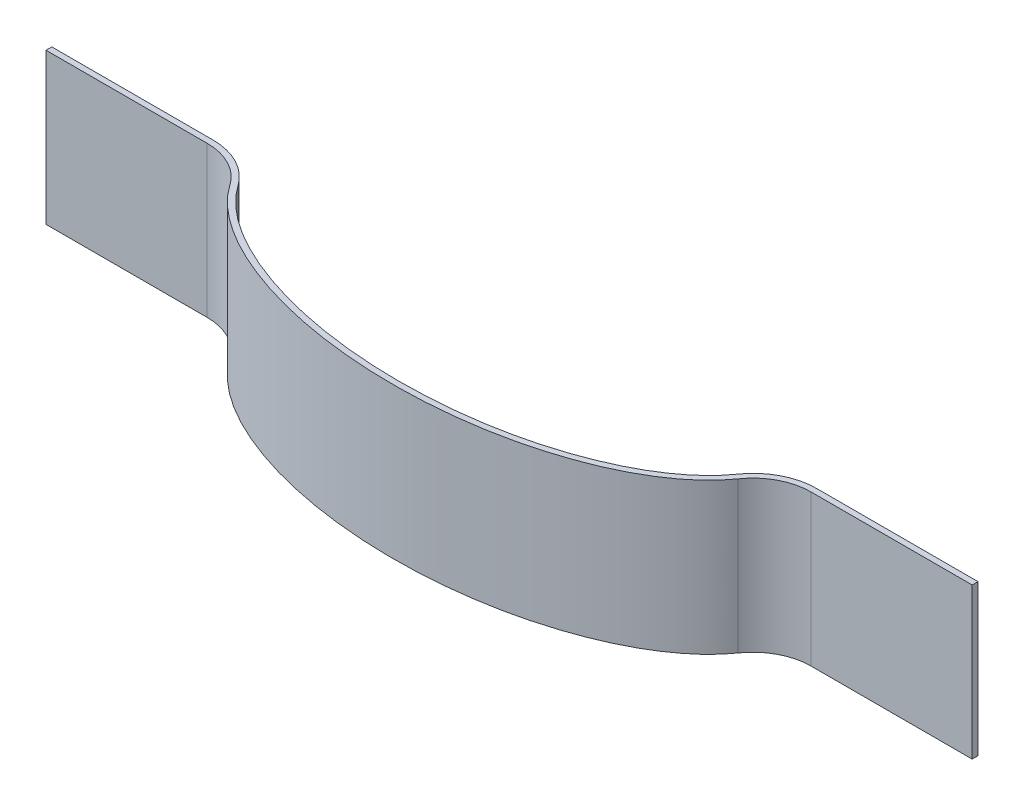
ISO-10303-21;
HEADER;
FILE_DESCRIPTION(('STEP AP214'),'2;1');
FILE_NAME('part.step','',(''),(''),'','','');
FILE_SCHEMA(('AUTOMOTIVE_DESIGN { 1 0 10303 214 1 1 1 1 }'));
ENDSEC;
DATA;
#1=APPLICATION_CONTEXT('core data for automotive mechanical design processes');
#2=APPLICATION_PROTOCOL_DEFINITION('international standard','automotive_design',2000,#1);
#3=PRODUCT_CONTEXT('',#1,'mechanical');
#4=PRODUCT('Part','Part','',(#3));
#5=PRODUCT_RELATED_PRODUCT_CATEGORY('part','',(#4));
#6=PRODUCT_DEFINITION_FORMATION('','',#4);
#7=PRODUCT_DEFINITION_CONTEXT('part definition',#1,'design');
#8=PRODUCT_DEFINITION('design','',#6,#7);
#9=PRODUCT_DEFINITION_SHAPE('','',#8);
#10=(LENGTH_UNIT() NAMED_UNIT(*) SI_UNIT(.MILLI.,.METRE.));
#11=(NAMED_UNIT(*) PLANE_ANGLE_UNIT() SI_UNIT($,.RADIAN.));
#12=(NAMED_UNIT(*) SI_UNIT($,.STERADIAN.) SOLID_ANGLE_UNIT());
#13=UNCERTAINTY_MEASURE_WITH_UNIT(LENGTH_MEASURE(1.E-05),#10,'distance_accuracy_value','');
#14=(GEOMETRIC_REPRESENTATION_CONTEXT(3) GLOBAL_UNCERTAINTY_ASSIGNED_CONTEXT((#13)) GLOBAL_UNIT_ASSIGNED_CONTEXT((#10,
#11,#12)) REPRESENTATION_CONTEXT('',''));
#15=CARTESIAN_POINT('',(0.,0.,0.));
#16=DIRECTION('',(0.,0.,1.));
#17=DIRECTION('',(1.,0.,0.));
#18=AXIS2_PLACEMENT_3D('',#15,#16,#17);
#19=CARTESIAN_POINT('',(82.8323720749977,15.9999999949704,4.99999999502958));
#20=DIRECTION('',(-1.,0.,0.));
#21=DIRECTION('',(0.,0.,1.));
#22=AXIS2_PLACEMENT_3D('',#19,#20,#21);
#23=PLANE('',#22);
#24=DIRECTION('',(0.,-1.,0.));
#25=VECTOR('',#24,1.);
#26=CARTESIAN_POINT('',(82.8323720749977,15.9999999949704,5.99999999502965));
#27=LINE('',#26,#25);
#28=CARTESIAN_POINT('',(82.8323720749977,15.9999999949704,5.99999999502965));
#29=VERTEX_POINT('',#28);
#30=CARTESIAN_POINT('',(82.8323720749977,3.,5.99999999502965));
#31=VERTEX_POINT('',#30);
#32=EDGE_CURVE('E404',#29,#31,#27,.T.);
#33=ORIENTED_EDGE('',*,*,#32,.T.);
#34=DIRECTION('',(0.,0.,-1.));
#35=VECTOR('',#34,1.);
#36=CARTESIAN_POINT('',(82.8323720749977,3.,4.99999999502958));
#37=LINE('',#36,#35);
#38=CARTESIAN_POINT('',(82.8323720749977,3.,5.49999999502962));
#39=VERTEX_POINT('',#38);
#40=EDGE_CURVE('E12',#31,#39,#37,.T.);
#41=ORIENTED_EDGE('',*,*,#40,.T.);
#42=DIRECTION('',(0.,-1.,0.));
#43=VECTOR('',#42,1.);
#44=CARTESIAN_POINT('',(82.8323720749977,15.9999999949704,5.49999999502962));
#45=LINE('',#44,#43);
#46=CARTESIAN_POINT('',(82.8323720749977,15.9999999949704,5.49999999502962));
#47=VERTEX_POINT('',#46);
#48=EDGE_CURVE('E322',#47,#39,#45,.T.);
#49=ORIENTED_EDGE('',*,*,#48,.F.);
#50=DIRECTION('',(0.,0.,-1.));
#51=VECTOR('',#50,1.);
#52=CARTESIAN_POINT('',(82.8323720749977,15.9999999949704,4.99999999502958));
#53=LINE('',#52,#51);
#54=EDGE_CURVE('E139',#29,#47,#53,.T.);
#55=ORIENTED_EDGE('',*,*,#54,.F.);
#56=EDGE_LOOP('',(#33,#41,#49,#55));
#57=FACE_BOUND('',#56,.T.);
#58=ADVANCED_FACE('F128',(#57),#23,.F.);
#59=CARTESIAN_POINT('',(3.,2.99999999999999,4.99999999502958));
#60=DIRECTION('',(1.,0.,0.));
#61=DIRECTION('',(0.,1.,0.));
#62=AXIS2_PLACEMENT_3D('',#59,#60,#61);
#63=PLANE('',#62);
#64=DIRECTION('',(0.,-1.,0.));
#65=VECTOR('',#64,1.);
#66=CARTESIAN_POINT('',(3.,15.9999999949704,5.99999999502963));
#67=LINE('',#66,#65);
#68=CARTESIAN_POINT('',(3.,15.9999999949704,5.99999999502963));
#69=VERTEX_POINT('',#68);
#70=CARTESIAN_POINT('',(3.,2.99999999999999,5.99999999502963));
#71=VERTEX_POINT('',#70);
#72=EDGE_CURVE('E399',#69,#71,#67,.T.);
#73=ORIENTED_EDGE('',*,*,#72,.F.);
#74=DIRECTION('',(0.,0.,-1.));
#75=VECTOR('',#74,1.);
#76=CARTESIAN_POINT('',(3.,15.9999999949704,4.99999999502958));
#77=LINE('',#76,#75);
#78=CARTESIAN_POINT('',(3.,15.9999999949704,5.49999999502963));
#79=VERTEX_POINT('',#78);
#80=EDGE_CURVE('E306',#69,#79,#77,.T.);
#81=ORIENTED_EDGE('',*,*,#80,.T.);
#82=DIRECTION('',(0.,-1.,0.));
#83=VECTOR('',#82,1.);
#84=CARTESIAN_POINT('',(3.,15.9999999949704,5.49999999502963));
#85=LINE('',#84,#83);
#86=CARTESIAN_POINT('',(3.,2.99999999999999,5.49999999502963));
#87=VERTEX_POINT('',#86);
#88=EDGE_CURVE('E327',#79,#87,#85,.T.);
#89=ORIENTED_EDGE('',*,*,#88,.T.);
#90=DIRECTION('',(0.,0.,-1.));
#91=VECTOR('',#90,1.);
#92=CARTESIAN_POINT('',(3.,2.99999999999999,4.99999999502958));
#93=LINE('',#92,#91);
#94=EDGE_CURVE('E304',#71,#87,#93,.T.);
#95=ORIENTED_EDGE('',*,*,#94,.F.);
#96=EDGE_LOOP('',(#73,#81,#89,#95));
#97=FACE_BOUND('',#96,.T.);
#98=ADVANCED_FACE('F263',(#97),#63,.F.);
#99=CARTESIAN_POINT('',(82.8323720749977,3.,4.99999999502958));
#100=DIRECTION('',(0.,1.,0.));
#101=DIRECTION('',(-1.,0.,0.));
#102=AXIS2_PLACEMENT_3D('',#99,#100,#101);
#103=PLANE('',#102);
#104=DIRECTION('',(-1.,0.,0.));
#105=VECTOR('',#104,1.);
#106=CARTESIAN_POINT('',(0.,2.99999999999999,5.99999999502965));
#107=LINE('',#106,#105);
#108=CARTESIAN_POINT('',(16.8897912138371,2.99999999999999,5.99999999502961));
#109=VERTEX_POINT('',#108);
#110=EDGE_CURVE('E411',#109,#71,#107,.T.);
#111=ORIENTED_EDGE('',*,*,#110,.T.);
#112=ORIENTED_EDGE('',*,*,#94,.T.);
#113=DIRECTION('',(-1.,0.,0.));
#114=VECTOR('',#113,1.);
#115=CARTESIAN_POINT('',(0.,2.99999999999999,5.49999999502965));
#116=LINE('',#115,#114);
#117=CARTESIAN_POINT('',(16.8897912138371,2.99999999999999,5.49999999502961));
#118=VERTEX_POINT('',#117);
#119=EDGE_CURVE('E289',#118,#87,#116,.T.);
#120=ORIENTED_EDGE('',*,*,#119,.F.);
#121=CARTESIAN_POINT('',(16.8897912138371,2.99999999999999,10.9999999950296));
#122=DIRECTION('',(0.,-1.,0.));
#123=DIRECTION('',(1.,0.,0.));
#124=AXIS2_PLACEMENT_3D('',#121,#122,#123);
#125=CIRCLE('',#124,5.5);
#126=CARTESIAN_POINT('',(21.4208754030492,2.99999999999999,7.88242464385167));
#127=VERTEX_POINT('',#126);
#128=EDGE_CURVE('E287',#118,#127,#125,.T.);
#129=ORIENTED_EDGE('',*,*,#128,.T.);
#130=CARTESIAN_POINT('',(64.4114966769508,3.,7.88242464385164));
#131=CARTESIAN_POINT('',(64.0982105866436,3.,8.33775466497044));
#132=CARTESIAN_POINT('',(63.6979550885632,3.,8.81019880400814));
#133=CARTESIAN_POINT('',(62.719285174443,3.,9.7593293623475));
#134=CARTESIAN_POINT('',(62.1396756208856,3.,10.2361082049393));
#135=CARTESIAN_POINT('',(60.8086565373389,3.,11.1616829851857));
#136=CARTESIAN_POINT('',(60.0576156971301,3.,11.6111938343619));
#137=CARTESIAN_POINT('',(58.4026791079221,3.,12.4553694381626));
#138=CARTESIAN_POINT('',(57.5000344392586,3.,12.8506130896263));
#139=CARTESIAN_POINT('',(55.5709026502186,3.,13.5729007530703));
#140=CARTESIAN_POINT('',(54.5444224769002,3.,13.899913376801));
#141=CARTESIAN_POINT('',(52.3946242077375,3.,14.4699824647709));
#142=CARTESIAN_POINT('',(51.2708466933238,3.,14.7121581623935));
#143=CARTESIAN_POINT('',(47.8022284438157,3.,15.2966803333091));
#144=CARTESIAN_POINT('',(45.3598366492572,3.,15.4999999950296));
#145=CARTESIAN_POINT('',(40.4725354307429,3.,15.4999999950296));
#146=CARTESIAN_POINT('',(38.0301436361843,3.,15.2966803333091));
#147=CARTESIAN_POINT('',(34.5615253866763,3.,14.7121581623935));
#148=CARTESIAN_POINT('',(33.4377478722626,3.,14.4699824647709));
#149=CARTESIAN_POINT('',(31.2879496030999,3.,13.899913376801));
#150=CARTESIAN_POINT('',(30.2614694297815,3.,13.5729007530703));
#151=CARTESIAN_POINT('',(28.3323376407414,3.,12.8506130896264));
#152=CARTESIAN_POINT('',(27.429692972078,3.,12.4553694381627));
#153=CARTESIAN_POINT('',(25.7747563828699,3.,11.6111938343619));
#154=CARTESIAN_POINT('',(25.0237155426611,3.,11.1616829851857));
#155=CARTESIAN_POINT('',(23.6926964591144,3.,10.2361082049393));
#156=CARTESIAN_POINT('',(23.113086905557,3.,9.75932936234752));
#157=CARTESIAN_POINT('',(22.1344169914368,3.,8.81019880400817));
#158=CARTESIAN_POINT('',(21.7341614933565,3.,8.33775466497047));
#159=CARTESIAN_POINT('',(21.4208754030492,3.,7.88242464385167));
#160=B_SPLINE_CURVE_WITH_KNOTS('',3,(#130,#131,#132,#133,#134,#135,#136,#137,#138,#139,#140,
#141,#142,#143,#144,#145,#146,#147,#148,#149,#150,#151,#152,#153,#154,#155,#156,#157,#158,#159),
.UNSPECIFIED.,.F.,.F.,(4,2,2,2,2,2,2,2,2,2,2,2,2,2,4),(0.,0.0624999999999999,0.125,0.1875,0.25,
0.312499999999999,0.374999999999999,0.499999999999999,0.624999999999999,0.6875,0.75,0.8125,
0.875,0.9375,1.),.UNSPECIFIED.);
#161=CARTESIAN_POINT('',(64.4114966769508,3.,7.88242464385164));
#162=VERTEX_POINT('',#161);
#163=EDGE_CURVE('E280',#162,#127,#160,.T.);
#164=ORIENTED_EDGE('',*,*,#163,.F.);
#165=CARTESIAN_POINT('',(68.9425808661629,3.,10.9999999950296));
#166=DIRECTION('',(0.,-1.,0.));
#167=DIRECTION('',(1.,0.,0.));
#168=AXIS2_PLACEMENT_3D('',#165,#166,#167);
#169=CIRCLE('',#168,5.5);
#170=CARTESIAN_POINT('',(68.9425808661629,3.,5.49999999502959));
#171=VERTEX_POINT('',#170);
#172=EDGE_CURVE('E284',#162,#171,#169,.T.);
#173=ORIENTED_EDGE('',*,*,#172,.T.);
#174=DIRECTION('',(-1.,0.,0.));
#175=VECTOR('',#174,1.);
#176=CARTESIAN_POINT('',(0.,2.99999999999999,5.49999999502933));
#177=LINE('',#176,#175);
#178=EDGE_CURVE('E369',#39,#171,#177,.T.);
#179=ORIENTED_EDGE('',*,*,#178,.F.);
#180=ORIENTED_EDGE('',*,*,#40,.F.);
#181=DIRECTION('',(-1.,0.,0.));
#182=VECTOR('',#181,1.);
#183=CARTESIAN_POINT('',(0.,2.99999999999999,5.99999999502933));
#184=LINE('',#183,#182);
#185=CARTESIAN_POINT('',(68.9425808661629,3.,5.99999999502959));
#186=VERTEX_POINT('',#185);
#187=EDGE_CURVE('E413',#31,#186,#184,.T.);
#188=ORIENTED_EDGE('',*,*,#187,.T.);
#189=CARTESIAN_POINT('',(68.9425808661629,3.,10.9999999950296));
#190=DIRECTION('',(0.,-1.,0.));
#191=DIRECTION('',(1.,0.,0.));
#192=AXIS2_PLACEMENT_3D('',#189,#190,#191);
#193=CIRCLE('',#192,5.);
#194=CARTESIAN_POINT('',(64.8234134214246,3.,8.16584058486782));
#195=VERTEX_POINT('',#194);
#196=EDGE_CURVE('E416',#195,#186,#193,.T.);
#197=ORIENTED_EDGE('',*,*,#196,.F.);
#198=CARTESIAN_POINT('',(21.0089586585754,3.,8.16584058486784));
#199=CARTESIAN_POINT('',(21.3430159331755,3.,8.65135944639593));
#200=CARTESIAN_POINT('',(21.7651551633497,3.,9.14859964038668));
#201=CARTESIAN_POINT('',(22.7861585524342,3.,10.1387859154183));
#202=CARTESIAN_POINT('',(23.3871393326019,3.,10.6326357513184));
#203=CARTESIAN_POINT('',(24.7583543140732,3.,11.5861622791005));
#204=CARTESIAN_POINT('',(25.5289772312057,3.,12.0471155712889));
#205=CARTESIAN_POINT('',(27.2210785746014,3.,12.9102487466432));
#206=CARTESIAN_POINT('',(28.1407416756007,3.,13.3127743563693));
#207=CARTESIAN_POINT('',(30.1024258111268,3.,14.0472499679963));
#208=CARTESIAN_POINT('',(31.1444329515369,3.,14.3791371933979));
#209=CARTESIAN_POINT('',(33.3249497752452,3.,14.9573520216565));
#210=CARTESIAN_POINT('',(34.4640292760914,3.,15.2027782012598));
#211=CARTESIAN_POINT('',(37.9758744088309,3.,15.7945848496851));
#212=CARTESIAN_POINT('',(40.4447714097168,3.,15.9999999950296));
#213=CARTESIAN_POINT('',(45.3876006702832,3.,15.9999999950296));
#214=CARTESIAN_POINT('',(47.8564976711691,3.,15.7945848496851));
#215=CARTESIAN_POINT('',(51.3683428039086,3.,15.2027782012598));
#216=CARTESIAN_POINT('',(52.5074223047549,3.,14.9573520216564));
#217=CARTESIAN_POINT('',(54.6879391284631,3.,14.3791371933979));
#218=CARTESIAN_POINT('',(55.7299462688733,3.,14.0472499679962));
#219=CARTESIAN_POINT('',(57.6916304043993,3.,13.3127743563693));
#220=CARTESIAN_POINT('',(58.6112935053986,3.,12.9102487466432));
#221=CARTESIAN_POINT('',(60.3033948487944,3.,12.0471155712889));
#222=CARTESIAN_POINT('',(61.0740177659268,3.,11.5861622791005));
#223=CARTESIAN_POINT('',(62.4452327473982,3.,10.6326357513184));
#224=CARTESIAN_POINT('',(63.0462135275658,3.,10.1387859154183));
#225=CARTESIAN_POINT('',(64.0672169166504,3.,9.14859964038665));
#226=CARTESIAN_POINT('',(64.4893561468245,3.,8.6513594463959));
#227=CARTESIAN_POINT('',(64.8234134214246,3.,8.16584058486781));
#228=B_SPLINE_CURVE_WITH_KNOTS('',3,(#198,#199,#200,#201,#202,#203,#204,#205,#206,#207,#208,
#209,#210,#211,#212,#213,#214,#215,#216,#217,#218,#219,#220,#221,#222,#223,#224,#225,#226,#227),
.UNSPECIFIED.,.F.,.F.,(4,2,2,2,2,2,2,2,2,2,2,2,2,2,4),(0.,0.0625000000000003,0.125000000000001,
0.187500000000001,0.250000000000001,0.312500000000001,0.375000000000001,0.500000000000001,
0.625000000000001,0.687500000000001,0.75,0.8125,0.875,0.9375,1.),.UNSPECIFIED.);
#229=CARTESIAN_POINT('',(21.0089586585754,2.99999999999999,8.16584058486784));
#230=VERTEX_POINT('',#229);
#231=EDGE_CURVE('E228',#195,#230,#228,.F.);
#232=ORIENTED_EDGE('',*,*,#231,.T.);
#233=CARTESIAN_POINT('',(16.8897912138371,2.99999999999999,10.9999999950296));
#234=DIRECTION('',(0.,-1.,0.));
#235=DIRECTION('',(1.,0.,0.));
#236=AXIS2_PLACEMENT_3D('',#233,#234,#235);
#237=CIRCLE('',#236,5.);
#238=EDGE_CURVE('E245',#109,#230,#237,.T.);
#239=ORIENTED_EDGE('',*,*,#238,.F.);
#240=EDGE_LOOP('',(#111,#112,#120,#129,#164,#173,#179,#180,#188,#197,#232,#239));
#241=FACE_BOUND('',#240,.T.);
#242=ADVANCED_FACE('F130',(#241),#103,.F.);
#243=CARTESIAN_POINT('',(3.,15.9999999949704,4.99999999502958));
#244=DIRECTION('',(0.,-1.,0.));
#245=DIRECTION('',(1.,0.,0.));
#246=AXIS2_PLACEMENT_3D('',#243,#244,#245);
#247=PLANE('',#246);
#248=DIRECTION('',(-1.,0.,0.));
#249=VECTOR('',#248,1.);
#250=CARTESIAN_POINT('',(0.,15.9999999949704,5.99999999502965));
#251=LINE('',#250,#249);
#252=CARTESIAN_POINT('',(16.8897912138371,15.9999999949704,5.99999999502961));
#253=VERTEX_POINT('',#252);
#254=EDGE_CURVE('E406',#253,#69,#251,.T.);
#255=ORIENTED_EDGE('',*,*,#254,.F.);
#256=CARTESIAN_POINT('',(16.8897912138371,15.9999999949704,10.9999999950296));
#257=DIRECTION('',(0.,-1.,0.));
#258=DIRECTION('',(1.,0.,0.));
#259=AXIS2_PLACEMENT_3D('',#256,#257,#258);
#260=CIRCLE('',#259,5.);
#261=CARTESIAN_POINT('',(21.0089586585754,15.9999999949704,8.16584058486784));
#262=VERTEX_POINT('',#261);
#263=EDGE_CURVE('E231',#253,#262,#260,.T.);
#264=ORIENTED_EDGE('',*,*,#263,.T.);
#265=CARTESIAN_POINT('',(64.8234134214246,15.9999999949704,8.16584058486781));
#266=CARTESIAN_POINT('',(64.4893561468245,15.9999999949704,8.6513594463959));
#267=CARTESIAN_POINT('',(64.0672169166504,15.9999999949704,9.14859964038665));
#268=CARTESIAN_POINT('',(63.0462135275658,15.9999999949704,10.1387859154183));
#269=CARTESIAN_POINT('',(62.4452327473982,15.9999999949704,10.6326357513184));
#270=CARTESIAN_POINT('',(61.0740177659268,15.9999999949704,11.5861622791005));
#271=CARTESIAN_POINT('',(60.3033948487944,15.9999999949704,12.0471155712889));
#272=CARTESIAN_POINT('',(58.6112935053986,15.9999999949704,12.9102487466432));
#273=CARTESIAN_POINT('',(57.6916304043993,15.9999999949704,13.3127743563693));
#274=CARTESIAN_POINT('',(55.7299462688733,15.9999999949704,14.0472499679962));
#275=CARTESIAN_POINT('',(54.6879391284631,15.9999999949704,14.3791371933979));
#276=CARTESIAN_POINT('',(52.5074223047549,15.9999999949704,14.9573520216564));
#277=CARTESIAN_POINT('',(51.3683428039086,15.9999999949704,15.2027782012598));
#278=CARTESIAN_POINT('',(47.8564976711691,15.9999999949704,15.7945848496851));
#279=CARTESIAN_POINT('',(45.3876006702832,15.9999999949704,15.9999999950296));
#280=CARTESIAN_POINT('',(40.4447714097168,15.9999999949704,15.9999999950296));
#281=CARTESIAN_POINT('',(37.9758744088309,15.9999999949704,15.7945848496851));
#282=CARTESIAN_POINT('',(34.4640292760914,15.9999999949704,15.2027782012598));
#283=CARTESIAN_POINT('',(33.3249497752452,15.9999999949704,14.9573520216565));
#284=CARTESIAN_POINT('',(31.1444329515369,15.9999999949704,14.3791371933979));
#285=CARTESIAN_POINT('',(30.1024258111268,15.9999999949704,14.0472499679963));
#286=CARTESIAN_POINT('',(28.1407416756007,15.9999999949704,13.3127743563693));
#287=CARTESIAN_POINT('',(27.2210785746014,15.9999999949704,12.9102487466432));
#288=CARTESIAN_POINT('',(25.5289772312057,15.9999999949704,12.0471155712889));
#289=CARTESIAN_POINT('',(24.7583543140732,15.9999999949704,11.5861622791005));
#290=CARTESIAN_POINT('',(23.3871393326019,15.9999999949704,10.6326357513184));
#291=CARTESIAN_POINT('',(22.7861585524342,15.9999999949704,10.1387859154183));
#292=CARTESIAN_POINT('',(21.7651551633497,15.9999999949704,9.14859964038668));
#293=CARTESIAN_POINT('',(21.3430159331755,15.9999999949704,8.65135944639593));
#294=CARTESIAN_POINT('',(21.0089586585754,15.9999999949704,8.16584058486784));
#295=B_SPLINE_CURVE_WITH_KNOTS('',3,(#265,#266,#267,#268,#269,#270,#271,#272,#273,#274,#275,
#276,#277,#278,#279,#280,#281,#282,#283,#284,#285,#286,#287,#288,#289,#290,#291,#292,#293,#294),
.UNSPECIFIED.,.F.,.F.,(4,2,2,2,2,2,2,2,2,2,2,2,2,2,4),(0.,0.0624999999999999,0.125,0.1875,0.25,
0.312499999999999,0.374999999999999,0.499999999999999,0.624999999999999,0.687499999999999,
0.749999999999999,0.812499999999999,0.874999999999999,0.9375,1.),.UNSPECIFIED.);
#296=CARTESIAN_POINT('',(64.8234134214246,15.9999999949704,8.16584058486782));
#297=VERTEX_POINT('',#296);
#298=EDGE_CURVE('E224',#297,#262,#295,.T.);
#299=ORIENTED_EDGE('',*,*,#298,.F.);
#300=CARTESIAN_POINT('',(68.9425808661629,15.9999999949704,10.9999999950296));
#301=DIRECTION('',(0.,-1.,0.));
#302=DIRECTION('',(1.,0.,0.));
#303=AXIS2_PLACEMENT_3D('',#300,#301,#302);
#304=CIRCLE('',#303,5.);
#305=CARTESIAN_POINT('',(68.9425808661629,15.9999999949703,5.99999999502959));
#306=VERTEX_POINT('',#305);
#307=EDGE_CURVE('E234',#297,#306,#304,.T.);
#308=ORIENTED_EDGE('',*,*,#307,.T.);
#309=DIRECTION('',(-1.,0.,0.));
#310=VECTOR('',#309,1.);
#311=CARTESIAN_POINT('',(0.,15.9999999949704,5.99999999502933));
#312=LINE('',#311,#310);
#313=EDGE_CURVE('E238',#29,#306,#312,.T.);
#314=ORIENTED_EDGE('',*,*,#313,.F.);
#315=ORIENTED_EDGE('',*,*,#54,.T.);
#316=DIRECTION('',(-1.,0.,0.));
#317=VECTOR('',#316,1.);
#318=CARTESIAN_POINT('',(0.,15.9999999949704,5.49999999502933));
#319=LINE('',#318,#317);
#320=CARTESIAN_POINT('',(68.9425808661629,15.9999999949704,5.49999999502959));
#321=VERTEX_POINT('',#320);
#322=EDGE_CURVE('E313',#47,#321,#319,.T.);
#323=ORIENTED_EDGE('',*,*,#322,.T.);
#324=CARTESIAN_POINT('',(68.9425808661629,15.9999999949704,10.9999999950296));
#325=DIRECTION('',(0.,-1.,0.));
#326=DIRECTION('',(1.,0.,0.));
#327=AXIS2_PLACEMENT_3D('',#324,#325,#326);
#328=CIRCLE('',#327,5.5);
#329=CARTESIAN_POINT('',(64.4114966769508,15.9999999949704,7.88242464385164));
#330=VERTEX_POINT('',#329);
#331=EDGE_CURVE('E370',#330,#321,#328,.T.);
#332=ORIENTED_EDGE('',*,*,#331,.F.);
#333=CARTESIAN_POINT('',(21.4208754030492,15.9999999949704,7.88242464385167));
#334=CARTESIAN_POINT('',(21.7341614933565,15.9999999949704,8.33775466497047));
#335=CARTESIAN_POINT('',(22.1344169914368,15.9999999949704,8.81019880400817));
#336=CARTESIAN_POINT('',(23.113086905557,15.9999999949704,9.75932936234752));
#337=CARTESIAN_POINT('',(23.6926964591144,15.9999999949704,10.2361082049393));
#338=CARTESIAN_POINT('',(25.0237155426611,15.9999999949704,11.1616829851857));
#339=CARTESIAN_POINT('',(25.7747563828699,15.9999999949704,11.6111938343619));
#340=CARTESIAN_POINT('',(27.429692972078,15.9999999949704,12.4553694381627));
#341=CARTESIAN_POINT('',(28.3323376407414,15.9999999949704,12.8506130896264));
#342=CARTESIAN_POINT('',(30.2614694297815,15.9999999949704,13.5729007530703));
#343=CARTESIAN_POINT('',(31.2879496030999,15.9999999949704,13.899913376801));
#344=CARTESIAN_POINT('',(33.4377478722626,15.9999999949704,14.4699824647709));
#345=CARTESIAN_POINT('',(34.5615253866763,15.9999999949704,14.7121581623935));
#346=CARTESIAN_POINT('',(38.0301436361843,15.9999999949704,15.2966803333091));
#347=CARTESIAN_POINT('',(40.4725354307429,15.9999999949704,15.4999999950296));
#348=CARTESIAN_POINT('',(45.3598366492572,15.9999999949704,15.4999999950296));
#349=CARTESIAN_POINT('',(47.8022284438157,15.9999999949704,15.2966803333091));
#350=CARTESIAN_POINT('',(51.2708466933238,15.9999999949704,14.7121581623935));
#351=CARTESIAN_POINT('',(52.3946242077375,15.9999999949704,14.4699824647709));
#352=CARTESIAN_POINT('',(54.5444224769002,15.9999999949704,13.899913376801));
#353=CARTESIAN_POINT('',(55.5709026502186,15.9999999949704,13.5729007530703));
#354=CARTESIAN_POINT('',(57.5000344392586,15.9999999949704,12.8506130896263));
#355=CARTESIAN_POINT('',(58.4026791079221,15.9999999949704,12.4553694381626));
#356=CARTESIAN_POINT('',(60.0576156971301,15.9999999949704,11.6111938343619));
#357=CARTESIAN_POINT('',(60.8086565373389,15.9999999949704,11.1616829851857));
#358=CARTESIAN_POINT('',(62.1396756208856,15.9999999949704,10.2361082049393));
#359=CARTESIAN_POINT('',(62.719285174443,15.9999999949704,9.7593293623475));
#360=CARTESIAN_POINT('',(63.6979550885632,15.9999999949704,8.81019880400814));
#361=CARTESIAN_POINT('',(64.0982105866436,15.9999999949704,8.33775466497044));
#362=CARTESIAN_POINT('',(64.4114966769508,15.9999999949704,7.88242464385164));
#363=B_SPLINE_CURVE_WITH_KNOTS('',3,(#333,#334,#335,#336,#337,#338,#339,#340,#341,#342,#343,
#344,#345,#346,#347,#348,#349,#350,#351,#352,#353,#354,#355,#356,#357,#358,#359,#360,#361,#362),
.UNSPECIFIED.,.F.,.F.,(4,2,2,2,2,2,2,2,2,2,2,2,2,2,4),(0.,0.0625000000000001,0.125,0.1875,0.25,
0.3125,0.375000000000001,0.500000000000001,0.625000000000001,0.687500000000001,0.75,0.8125,
0.875,0.9375,1.),.UNSPECIFIED.);
#364=CARTESIAN_POINT('',(21.4208754030492,15.9999999949704,7.88242464385167));
#365=VERTEX_POINT('',#364);
#366=EDGE_CURVE('E337',#330,#365,#363,.F.);
#367=ORIENTED_EDGE('',*,*,#366,.T.);
#368=CARTESIAN_POINT('',(16.8897912138371,15.9999999949704,10.9999999950296));
#369=DIRECTION('',(0.,-1.,0.));
#370=DIRECTION('',(1.,0.,0.));
#371=AXIS2_PLACEMENT_3D('',#368,#369,#370);
#372=CIRCLE('',#371,5.5);
#373=CARTESIAN_POINT('',(16.8897912138371,15.9999999949704,5.49999999502961));
#374=VERTEX_POINT('',#373);
#375=EDGE_CURVE('E366',#374,#365,#372,.T.);
#376=ORIENTED_EDGE('',*,*,#375,.F.);
#377=DIRECTION('',(-1.,0.,0.));
#378=VECTOR('',#377,1.);
#379=CARTESIAN_POINT('',(0.,15.9999999949704,5.49999999502965));
#380=LINE('',#379,#378);
#381=EDGE_CURVE('E324',#374,#79,#380,.T.);
#382=ORIENTED_EDGE('',*,*,#381,.T.);
#383=ORIENTED_EDGE('',*,*,#80,.F.);
#384=EDGE_LOOP('',(#255,#264,#299,#308,#314,#315,#323,#332,#367,#376,#382,#383));
#385=FACE_BOUND('',#384,.T.);
#386=ADVANCED_FACE('F243',(#385),#247,.F.);
#387=CARTESIAN_POINT('',(68.9425808661629,15.9999999949704,10.9999999950296));
#388=DIRECTION('',(0.,-1.,0.));
#389=DIRECTION('',(1.,0.,0.));
#390=AXIS2_PLACEMENT_3D('',#387,#388,#389);
#391=CYLINDRICAL_SURFACE('',#390,5.5);
#392=ORIENTED_EDGE('',*,*,#172,.F.);
#393=DIRECTION('',(0.,-1.,0.));
#394=VECTOR('',#393,1.);
#395=CARTESIAN_POINT('',(64.4114966769508,15.9999999949704,7.88242464385164));
#396=LINE('',#395,#394);
#397=EDGE_CURVE('E323',#330,#162,#396,.T.);
#398=ORIENTED_EDGE('',*,*,#397,.F.);
#399=ORIENTED_EDGE('',*,*,#331,.T.);
#400=DIRECTION('',(0.,-1.,0.));
#401=VECTOR('',#400,1.);
#402=CARTESIAN_POINT('',(68.9425808661629,15.9999999949704,5.49999999502959));
#403=LINE('',#402,#401);
#404=EDGE_CURVE('E307',#321,#171,#403,.T.);
#405=ORIENTED_EDGE('',*,*,#404,.T.);
#406=EDGE_LOOP('',(#392,#398,#399,#405));
#407=FACE_BOUND('',#406,.T.);
#408=ADVANCED_FACE('F262',(#407),#391,.T.);
#409=CARTESIAN_POINT('',(0.,15.9999999949704,5.49999999502933));
#410=DIRECTION('',(0.,0.,1.));
#411=DIRECTION('',(1.,0.,0.));
#412=AXIS2_PLACEMENT_3D('',#409,#410,#411);
#413=PLANE('',#412);
#414=ORIENTED_EDGE('',*,*,#178,.T.);
#415=ORIENTED_EDGE('',*,*,#404,.F.);
#416=ORIENTED_EDGE('',*,*,#322,.F.);
#417=ORIENTED_EDGE('',*,*,#48,.T.);
#418=EDGE_LOOP('',(#414,#415,#416,#417));
#419=FACE_BOUND('',#418,.T.);
#420=ADVANCED_FACE('F321',(#419),#413,.F.);
#421=CARTESIAN_POINT('',(0.,15.9999999949704,5.49999999502965));
#422=DIRECTION('',(0.,0.,1.));
#423=DIRECTION('',(1.,0.,0.));
#424=AXIS2_PLACEMENT_3D('',#421,#422,#423);
#425=PLANE('',#424);
#426=ORIENTED_EDGE('',*,*,#119,.T.);
#427=ORIENTED_EDGE('',*,*,#88,.F.);
#428=ORIENTED_EDGE('',*,*,#381,.F.);
#429=DIRECTION('',(0.,-1.,0.));
#430=VECTOR('',#429,1.);
#431=CARTESIAN_POINT('',(16.8897912138371,15.9999999949704,5.49999999502961));
#432=LINE('',#431,#430);
#433=EDGE_CURVE('E331',#374,#118,#432,.T.);
#434=ORIENTED_EDGE('',*,*,#433,.T.);
#435=EDGE_LOOP('',(#426,#427,#428,#434));
#436=FACE_BOUND('',#435,.T.);
#437=ADVANCED_FACE('F387',(#436),#425,.F.);
#438=CARTESIAN_POINT('',(16.8897912138371,15.9999999949704,10.9999999950296));
#439=DIRECTION('',(0.,-1.,0.));
#440=DIRECTION('',(1.,0.,0.));
#441=AXIS2_PLACEMENT_3D('',#438,#439,#440);
#442=CYLINDRICAL_SURFACE('',#441,5.5);
#443=ORIENTED_EDGE('',*,*,#128,.F.);
#444=ORIENTED_EDGE('',*,*,#433,.F.);
#445=ORIENTED_EDGE('',*,*,#375,.T.);
#446=DIRECTION('',(0.,-1.,0.));
#447=VECTOR('',#446,1.);
#448=CARTESIAN_POINT('',(21.4208754030492,15.9999999949704,7.88242464385167));
#449=LINE('',#448,#447);
#450=EDGE_CURVE('E155',#365,#127,#449,.T.);
#451=ORIENTED_EDGE('',*,*,#450,.T.);
#452=EDGE_LOOP('',(#443,#444,#445,#451));
#453=FACE_BOUND('',#452,.T.);
#454=ADVANCED_FACE('F352',(#453),#442,.T.);
#455=CARTESIAN_POINT('',(64.4114966769508,15.9999999949704,7.88242464385164));
#456=CARTESIAN_POINT('',(64.0982105866436,15.9999999949704,8.33775466497044));
#457=CARTESIAN_POINT('',(63.6979550885632,15.9999999949704,8.81019880400814));
#458=CARTESIAN_POINT('',(62.719285174443,15.9999999949704,9.7593293623475));
#459=CARTESIAN_POINT('',(62.1396756208856,15.9999999949704,10.2361082049393));
#460=CARTESIAN_POINT('',(60.8086565373389,15.9999999949704,11.1616829851857));
#461=CARTESIAN_POINT('',(60.0576156971301,15.9999999949704,11.6111938343619));
#462=CARTESIAN_POINT('',(58.4026791079221,15.9999999949704,12.4553694381626));
#463=CARTESIAN_POINT('',(57.5000344392586,15.9999999949704,12.8506130896263));
#464=CARTESIAN_POINT('',(55.5709026502186,15.9999999949704,13.5729007530703));
#465=CARTESIAN_POINT('',(54.5444224769002,15.9999999949704,13.899913376801));
#466=CARTESIAN_POINT('',(52.3946242077375,15.9999999949704,14.4699824647709));
#467=CARTESIAN_POINT('',(51.2708466933238,15.9999999949704,14.7121581623935));
#468=CARTESIAN_POINT('',(47.8022284438157,15.9999999949704,15.2966803333091));
#469=CARTESIAN_POINT('',(45.3598366492572,15.9999999949704,15.4999999950296));
#470=CARTESIAN_POINT('',(40.4725354307429,15.9999999949704,15.4999999950296));
#471=CARTESIAN_POINT('',(38.0301436361843,15.9999999949704,15.2966803333091));
#472=CARTESIAN_POINT('',(34.5615253866763,15.9999999949704,14.7121581623935));
#473=CARTESIAN_POINT('',(33.4377478722626,15.9999999949704,14.4699824647709));
#474=CARTESIAN_POINT('',(31.2879496030999,15.9999999949704,13.899913376801));
#475=CARTESIAN_POINT('',(30.2614694297815,15.9999999949704,13.5729007530703));
#476=CARTESIAN_POINT('',(28.3323376407414,15.9999999949704,12.8506130896264));
#477=CARTESIAN_POINT('',(27.429692972078,15.9999999949704,12.4553694381627));
#478=CARTESIAN_POINT('',(25.7747563828699,15.9999999949704,11.6111938343619));
#479=CARTESIAN_POINT('',(25.0237155426611,15.9999999949704,11.1616829851857));
#480=CARTESIAN_POINT('',(23.6926964591144,15.9999999949704,10.2361082049393));
#481=CARTESIAN_POINT('',(23.113086905557,15.9999999949704,9.75932936234752));
#482=CARTESIAN_POINT('',(22.1344169914368,15.9999999949704,8.81019880400817));
#483=CARTESIAN_POINT('',(21.7341614933565,15.9999999949704,8.33775466497047));
#484=CARTESIAN_POINT('',(21.4208754030492,15.9999999949704,7.88242464385167));
#485=B_SPLINE_CURVE_WITH_KNOTS('',3,(#455,#456,#457,#458,#459,#460,#461,#462,#463,#464,#465,
#466,#467,#468,#469,#470,#471,#472,#473,#474,#475,#476,#477,#478,#479,#480,#481,#482,#483,#484),
.UNSPECIFIED.,.F.,.F.,(4,2,2,2,2,2,2,2,2,2,2,2,2,2,4),(0.,0.0624999999999999,0.125,0.1875,0.25,
0.312499999999999,0.374999999999999,0.499999999999999,0.624999999999999,0.6875,0.75,0.8125,
0.875,0.9375,1.),.UNSPECIFIED.);
#486=DIRECTION('',(0.,-1.,0.));
#487=VECTOR('',#486,1.);
#488=SURFACE_OF_LINEAR_EXTRUSION('',#485,#487);
#489=ORIENTED_EDGE('',*,*,#163,.T.);
#490=ORIENTED_EDGE('',*,*,#450,.F.);
#491=ORIENTED_EDGE('',*,*,#366,.F.);
#492=ORIENTED_EDGE('',*,*,#397,.T.);
#493=EDGE_LOOP('',(#489,#490,#491,#492));
#494=FACE_BOUND('',#493,.T.);
#495=ADVANCED_FACE('F342',(#494),#488,.F.);
#496=CARTESIAN_POINT('',(64.8234134214246,15.9999999949704,8.16584058486781));
#497=CARTESIAN_POINT('',(64.4893561468245,15.9999999949704,8.6513594463959));
#498=CARTESIAN_POINT('',(64.0672169166504,15.9999999949704,9.14859964038665));
#499=CARTESIAN_POINT('',(63.0462135275658,15.9999999949704,10.1387859154183));
#500=CARTESIAN_POINT('',(62.4452327473982,15.9999999949704,10.6326357513184));
#501=CARTESIAN_POINT('',(61.0740177659268,15.9999999949704,11.5861622791005));
#502=CARTESIAN_POINT('',(60.3033948487944,15.9999999949704,12.0471155712889));
#503=CARTESIAN_POINT('',(58.6112935053986,15.9999999949704,12.9102487466432));
#504=CARTESIAN_POINT('',(57.6916304043993,15.9999999949704,13.3127743563693));
#505=CARTESIAN_POINT('',(55.7299462688733,15.9999999949704,14.0472499679962));
#506=CARTESIAN_POINT('',(54.6879391284631,15.9999999949704,14.3791371933979));
#507=CARTESIAN_POINT('',(52.5074223047549,15.9999999949704,14.9573520216564));
#508=CARTESIAN_POINT('',(51.3683428039086,15.9999999949704,15.2027782012598));
#509=CARTESIAN_POINT('',(47.8564976711691,15.9999999949704,15.7945848496851));
#510=CARTESIAN_POINT('',(45.3876006702832,15.9999999949704,15.9999999950296));
#511=CARTESIAN_POINT('',(40.4447714097168,15.9999999949704,15.9999999950296));
#512=CARTESIAN_POINT('',(37.9758744088309,15.9999999949704,15.7945848496851));
#513=CARTESIAN_POINT('',(34.4640292760914,15.9999999949704,15.2027782012598));
#514=CARTESIAN_POINT('',(33.3249497752452,15.9999999949704,14.9573520216565));
#515=CARTESIAN_POINT('',(31.1444329515369,15.9999999949704,14.3791371933979));
#516=CARTESIAN_POINT('',(30.1024258111268,15.9999999949704,14.0472499679963));
#517=CARTESIAN_POINT('',(28.1407416756007,15.9999999949704,13.3127743563693));
#518=CARTESIAN_POINT('',(27.2210785746014,15.9999999949704,12.9102487466432));
#519=CARTESIAN_POINT('',(25.5289772312057,15.9999999949704,12.0471155712889));
#520=CARTESIAN_POINT('',(24.7583543140732,15.9999999949704,11.5861622791005));
#521=CARTESIAN_POINT('',(23.3871393326019,15.9999999949704,10.6326357513184));
#522=CARTESIAN_POINT('',(22.7861585524342,15.9999999949704,10.1387859154183));
#523=CARTESIAN_POINT('',(21.7651551633497,15.9999999949704,9.14859964038668));
#524=CARTESIAN_POINT('',(21.3430159331755,15.9999999949704,8.65135944639593));
#525=CARTESIAN_POINT('',(21.0089586585754,15.9999999949704,8.16584058486784));
#526=B_SPLINE_CURVE_WITH_KNOTS('',3,(#496,#497,#498,#499,#500,#501,#502,#503,#504,#505,#506,
#507,#508,#509,#510,#511,#512,#513,#514,#515,#516,#517,#518,#519,#520,#521,#522,#523,#524,#525),
.UNSPECIFIED.,.F.,.F.,(4,2,2,2,2,2,2,2,2,2,2,2,2,2,4),(0.,0.0624999999999999,0.125,0.1875,0.25,
0.312499999999999,0.374999999999999,0.499999999999999,0.624999999999999,0.687499999999999,
0.749999999999999,0.812499999999999,0.874999999999999,0.9375,1.),.UNSPECIFIED.);
#527=DIRECTION('',(0.,-1.,0.));
#528=VECTOR('',#527,1.);
#529=SURFACE_OF_LINEAR_EXTRUSION('',#526,#528);
#530=ORIENTED_EDGE('',*,*,#231,.F.);
#531=DIRECTION('',(0.,-1.,0.));
#532=VECTOR('',#531,1.);
#533=CARTESIAN_POINT('',(64.8234134214246,15.9999999949704,8.16584058486782));
#534=LINE('',#533,#532);
#535=EDGE_CURVE('E221',#297,#195,#534,.T.);
#536=ORIENTED_EDGE('',*,*,#535,.F.);
#537=ORIENTED_EDGE('',*,*,#298,.T.);
#538=DIRECTION('',(0.,-1.,0.));
#539=VECTOR('',#538,1.);
#540=CARTESIAN_POINT('',(21.0089586585754,15.9999999949704,8.16584058486784));
#541=LINE('',#540,#539);
#542=EDGE_CURVE('E291',#262,#230,#541,.T.);
#543=ORIENTED_EDGE('',*,*,#542,.T.);
#544=EDGE_LOOP('',(#530,#536,#537,#543));
#545=FACE_BOUND('',#544,.T.);
#546=ADVANCED_FACE('F222',(#545),#529,.T.);
#547=CARTESIAN_POINT('',(16.8897912138371,15.9999999949704,10.9999999950296));
#548=DIRECTION('',(0.,-1.,0.));
#549=DIRECTION('',(1.,0.,0.));
#550=AXIS2_PLACEMENT_3D('',#547,#548,#549);
#551=CYLINDRICAL_SURFACE('',#550,5.);
#552=ORIENTED_EDGE('',*,*,#238,.T.);
#553=ORIENTED_EDGE('',*,*,#542,.F.);
#554=ORIENTED_EDGE('',*,*,#263,.F.);
#555=DIRECTION('',(0.,-1.,0.));
#556=VECTOR('',#555,1.);
#557=CARTESIAN_POINT('',(16.8897912138371,15.9999999949704,5.99999999502961));
#558=LINE('',#557,#556);
#559=EDGE_CURVE('E293',#253,#109,#558,.T.);
#560=ORIENTED_EDGE('',*,*,#559,.T.);
#561=EDGE_LOOP('',(#552,#553,#554,#560));
#562=FACE_BOUND('',#561,.T.);
#563=ADVANCED_FACE('F436',(#562),#551,.F.);
#564=CARTESIAN_POINT('',(0.,15.9999999949704,5.99999999502965));
#565=DIRECTION('',(0.,0.,1.));
#566=DIRECTION('',(1.,0.,0.));
#567=AXIS2_PLACEMENT_3D('',#564,#565,#566);
#568=PLANE('',#567);
#569=ORIENTED_EDGE('',*,*,#110,.F.);
#570=ORIENTED_EDGE('',*,*,#559,.F.);
#571=ORIENTED_EDGE('',*,*,#254,.T.);
#572=ORIENTED_EDGE('',*,*,#72,.T.);
#573=EDGE_LOOP('',(#569,#570,#571,#572));
#574=FACE_BOUND('',#573,.T.);
#575=ADVANCED_FACE('F465',(#574),#568,.T.);
#576=CARTESIAN_POINT('',(0.,15.9999999949704,5.99999999502933));
#577=DIRECTION('',(0.,0.,1.));
#578=DIRECTION('',(1.,0.,0.));
#579=AXIS2_PLACEMENT_3D('',#576,#577,#578);
#580=PLANE('',#579);
#581=ORIENTED_EDGE('',*,*,#187,.F.);
#582=ORIENTED_EDGE('',*,*,#32,.F.);
#583=ORIENTED_EDGE('',*,*,#313,.T.);
#584=DIRECTION('',(0.,-1.,0.));
#585=VECTOR('',#584,1.);
#586=CARTESIAN_POINT('',(68.9425808661629,15.9999999949704,5.99999999502959));
#587=LINE('',#586,#585);
#588=EDGE_CURVE('E147',#306,#186,#587,.T.);
#589=ORIENTED_EDGE('',*,*,#588,.T.);
#590=EDGE_LOOP('',(#581,#582,#583,#589));
#591=FACE_BOUND('',#590,.T.);
#592=ADVANCED_FACE('F463',(#591),#580,.T.);
#593=CARTESIAN_POINT('',(68.9425808661629,15.9999999949704,10.9999999950296));
#594=DIRECTION('',(0.,-1.,0.));
#595=DIRECTION('',(1.,0.,0.));
#596=AXIS2_PLACEMENT_3D('',#593,#594,#595);
#597=CYLINDRICAL_SURFACE('',#596,5.);
#598=ORIENTED_EDGE('',*,*,#196,.T.);
#599=ORIENTED_EDGE('',*,*,#588,.F.);
#600=ORIENTED_EDGE('',*,*,#307,.F.);
#601=ORIENTED_EDGE('',*,*,#535,.T.);
#602=EDGE_LOOP('',(#598,#599,#600,#601));
#603=FACE_BOUND('',#602,.T.);
#604=ADVANCED_FACE('F235',(#603),#597,.F.);
#605=CLOSED_SHELL('',(#58,#98,#242,#386,#408,#420,#437,#454,#495,#546,#563,#575,#592,#604));
#606=MANIFOLD_SOLID_BREP('B2',#605);
#607=ADVANCED_BREP_SHAPE_REPRESENTATION('',(#18,#606),#14);
#608=SHAPE_DEFINITION_REPRESENTATION(#9,#607);
ENDSEC;
END-ISO-10303-21;
